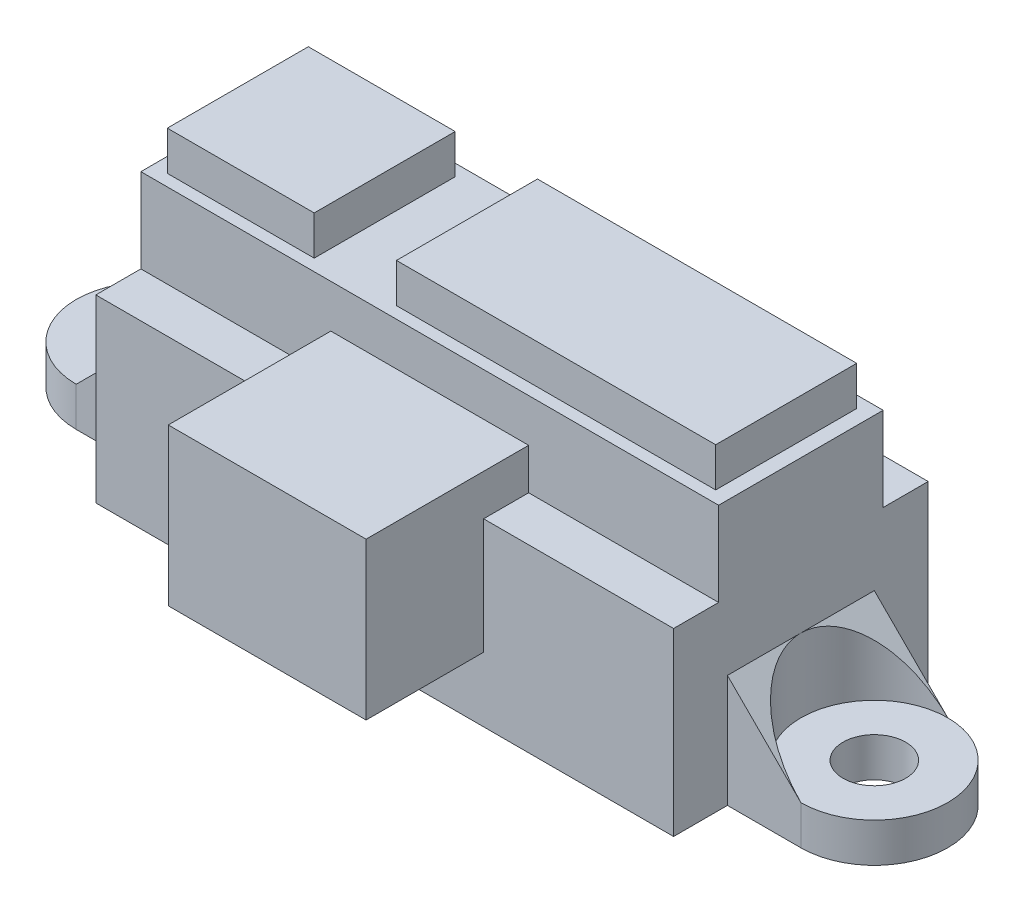
ISO-10303-21;
HEADER;
FILE_DESCRIPTION(('STEP AP214'),'2;1');
FILE_NAME('part.step','',(''),(''),'','','');
FILE_SCHEMA(('AUTOMOTIVE_DESIGN { 1 0 10303 214 1 1 1 1 }'));
ENDSEC;
DATA;
#1=APPLICATION_CONTEXT('core data for automotive mechanical design processes');
#2=APPLICATION_PROTOCOL_DEFINITION('international standard','automotive_design',2000,#1);
#3=PRODUCT_CONTEXT('',#1,'mechanical');
#4=PRODUCT('Part','Part','',(#3));
#5=PRODUCT_RELATED_PRODUCT_CATEGORY('part','',(#4));
#6=PRODUCT_DEFINITION_FORMATION('','',#4);
#7=PRODUCT_DEFINITION_CONTEXT('part definition',#1,'design');
#8=PRODUCT_DEFINITION('design','',#6,#7);
#9=PRODUCT_DEFINITION_SHAPE('','',#8);
#10=(LENGTH_UNIT() NAMED_UNIT(*) SI_UNIT(.MILLI.,.METRE.));
#11=(NAMED_UNIT(*) PLANE_ANGLE_UNIT() SI_UNIT($,.RADIAN.));
#12=(NAMED_UNIT(*) SI_UNIT($,.STERADIAN.) SOLID_ANGLE_UNIT());
#13=UNCERTAINTY_MEASURE_WITH_UNIT(LENGTH_MEASURE(1.E-05),#10,'distance_accuracy_value','');
#14=(GEOMETRIC_REPRESENTATION_CONTEXT(3) GLOBAL_UNCERTAINTY_ASSIGNED_CONTEXT((#13)) GLOBAL_UNIT_ASSIGNED_CONTEXT((#10,
#11,#12)) REPRESENTATION_CONTEXT('',''));
#15=CARTESIAN_POINT('',(0.,0.,0.));
#16=DIRECTION('',(0.,0.,1.));
#17=DIRECTION('',(1.,0.,0.));
#18=AXIS2_PLACEMENT_3D('',#15,#16,#17);
#19=CARTESIAN_POINT('',(14.75,9.2,6.5));
#20=DIRECTION('',(0.,1.,0.));
#21=DIRECTION('',(0.,0.,1.));
#22=AXIS2_PLACEMENT_3D('',#19,#20,#21);
#23=PLANE('',#22);
#24=DIRECTION('',(1.,0.,0.));
#25=VECTOR('',#24,1.);
#26=CARTESIAN_POINT('',(-14.75,9.2,4.2));
#27=LINE('',#26,#25);
#28=CARTESIAN_POINT('',(5.04999999999998,9.2,4.2));
#29=VERTEX_POINT('',#28);
#30=CARTESIAN_POINT('',(14.75,9.2,4.2));
#31=VERTEX_POINT('',#30);
#32=EDGE_CURVE('E351',#29,#31,#27,.T.);
#33=ORIENTED_EDGE('',*,*,#32,.F.);
#34=DIRECTION('',(0.,0.,1.));
#35=VECTOR('',#34,1.);
#36=CARTESIAN_POINT('',(5.04999999999998,9.2,6.5));
#37=LINE('',#36,#35);
#38=CARTESIAN_POINT('',(5.04999999999998,9.2,6.5));
#39=VERTEX_POINT('',#38);
#40=EDGE_CURVE('E269',#29,#39,#37,.T.);
#41=ORIENTED_EDGE('',*,*,#40,.T.);
#42=DIRECTION('',(-1.,0.,0.));
#43=VECTOR('',#42,1.);
#44=CARTESIAN_POINT('',(-14.75,9.2,6.5));
#45=LINE('',#44,#43);
#46=CARTESIAN_POINT('',(14.75,9.2,6.5));
#47=VERTEX_POINT('',#46);
#48=EDGE_CURVE('E368',#47,#39,#45,.T.);
#49=ORIENTED_EDGE('',*,*,#48,.F.);
#50=DIRECTION('',(0.,0.,1.));
#51=VECTOR('',#50,1.);
#52=CARTESIAN_POINT('',(14.75,9.2,-6.5));
#53=LINE('',#52,#51);
#54=EDGE_CURVE('E367',#31,#47,#53,.T.);
#55=ORIENTED_EDGE('',*,*,#54,.F.);
#56=EDGE_LOOP('',(#33,#41,#49,#55));
#57=FACE_BOUND('',#56,.T.);
#58=ADVANCED_FACE('F35',(#57),#23,.T.);
#59=CARTESIAN_POINT('',(-5.05000000000002,9.2,6.5));
#60=VERTEX_POINT('',#59);
#61=CARTESIAN_POINT('',(-14.75,9.2,6.5));
#62=VERTEX_POINT('',#61);
#63=EDGE_CURVE('E366',#60,#62,#45,.T.);
#64=ORIENTED_EDGE('',*,*,#63,.F.);
#65=DIRECTION('',(0.,0.,-1.));
#66=VECTOR('',#65,1.);
#67=CARTESIAN_POINT('',(-5.05000000000002,9.2,6.5));
#68=LINE('',#67,#66);
#69=CARTESIAN_POINT('',(-5.05000000000002,9.2,4.2));
#70=VERTEX_POINT('',#69);
#71=EDGE_CURVE('E259',#60,#70,#68,.T.);
#72=ORIENTED_EDGE('',*,*,#71,.T.);
#73=CARTESIAN_POINT('',(-14.75,9.2,4.2));
#74=VERTEX_POINT('',#73);
#75=EDGE_CURVE('E343',#74,#70,#27,.T.);
#76=ORIENTED_EDGE('',*,*,#75,.F.);
#77=DIRECTION('',(0.,0.,-1.));
#78=VECTOR('',#77,1.);
#79=CARTESIAN_POINT('',(-14.75,9.2,-6.5));
#80=LINE('',#79,#78);
#81=EDGE_CURVE('E371',#62,#74,#80,.T.);
#82=ORIENTED_EDGE('',*,*,#81,.F.);
#83=EDGE_LOOP('',(#64,#72,#76,#82));
#84=FACE_BOUND('',#83,.T.);
#85=ADVANCED_FACE('F526',(#84),#23,.T.);
#86=CARTESIAN_POINT('',(-14.75,9.2,6.5));
#87=DIRECTION('',(0.,0.,1.));
#88=DIRECTION('',(1.,0.,0.));
#89=AXIS2_PLACEMENT_3D('',#86,#87,#88);
#90=PLANE('',#89);
#91=ORIENTED_EDGE('',*,*,#48,.T.);
#92=DIRECTION('',(0.,-1.,0.));
#93=VECTOR('',#92,1.);
#94=CARTESIAN_POINT('',(5.04999999999998,9.2,6.5));
#95=LINE('',#94,#93);
#96=CARTESIAN_POINT('',(5.04999999999998,3.3,6.5));
#97=VERTEX_POINT('',#96);
#98=EDGE_CURVE('E53',#39,#97,#95,.T.);
#99=ORIENTED_EDGE('',*,*,#98,.T.);
#100=DIRECTION('',(-1.,0.,0.));
#101=VECTOR('',#100,1.);
#102=CARTESIAN_POINT('',(-14.75,3.3,6.5));
#103=LINE('',#102,#101);
#104=CARTESIAN_POINT('',(-5.05000000000002,3.3,6.5));
#105=VERTEX_POINT('',#104);
#106=EDGE_CURVE('E11',#97,#105,#103,.T.);
#107=ORIENTED_EDGE('',*,*,#106,.T.);
#108=DIRECTION('',(0.,1.,0.));
#109=VECTOR('',#108,1.);
#110=CARTESIAN_POINT('',(-5.05000000000002,9.2,6.5));
#111=LINE('',#110,#109);
#112=EDGE_CURVE('E262',#105,#60,#111,.T.);
#113=ORIENTED_EDGE('',*,*,#112,.T.);
#114=ORIENTED_EDGE('',*,*,#63,.T.);
#115=DIRECTION('',(0.,-1.,0.));
#116=VECTOR('',#115,1.);
#117=CARTESIAN_POINT('',(-14.75,9.2,6.5));
#118=LINE('',#117,#116);
#119=CARTESIAN_POINT('',(-14.75,0.,6.5));
#120=VERTEX_POINT('',#119);
#121=EDGE_CURVE('E397',#62,#120,#118,.T.);
#122=ORIENTED_EDGE('',*,*,#121,.T.);
#123=DIRECTION('',(-1.,0.,0.));
#124=VECTOR('',#123,1.);
#125=CARTESIAN_POINT('',(-14.75,0.,6.5));
#126=LINE('',#125,#124);
#127=CARTESIAN_POINT('',(14.75,0.,6.5));
#128=VERTEX_POINT('',#127);
#129=EDGE_CURVE('E381',#128,#120,#126,.T.);
#130=ORIENTED_EDGE('',*,*,#129,.F.);
#131=DIRECTION('',(0.,-1.,0.));
#132=VECTOR('',#131,1.);
#133=CARTESIAN_POINT('',(14.75,9.2,6.5));
#134=LINE('',#133,#132);
#135=EDGE_CURVE('E377',#47,#128,#134,.T.);
#136=ORIENTED_EDGE('',*,*,#135,.F.);
#137=EDGE_LOOP('',(#91,#99,#107,#113,#114,#122,#130,#136));
#138=FACE_BOUND('',#137,.T.);
#139=ADVANCED_FACE('F499',(#138),#90,.T.);
#140=CARTESIAN_POINT('',(-14.75,13.5,4.2));
#141=DIRECTION('',(0.,0.,-1.));
#142=DIRECTION('',(-1.,0.,0.));
#143=AXIS2_PLACEMENT_3D('',#140,#141,#142);
#144=PLANE('',#143);
#145=DIRECTION('',(0.,1.,0.));
#146=VECTOR('',#145,1.);
#147=CARTESIAN_POINT('',(5.04999999999998,13.5,4.2));
#148=LINE('',#147,#146);
#149=CARTESIAN_POINT('',(5.04999999999998,11.3,4.2));
#150=VERTEX_POINT('',#149);
#151=EDGE_CURVE('E43',#29,#150,#148,.T.);
#152=ORIENTED_EDGE('',*,*,#151,.F.);
#153=ORIENTED_EDGE('',*,*,#32,.T.);
#154=DIRECTION('',(0.,-1.,0.));
#155=VECTOR('',#154,1.);
#156=CARTESIAN_POINT('',(14.75,13.5,4.2));
#157=LINE('',#156,#155);
#158=CARTESIAN_POINT('',(14.75,13.5,4.2));
#159=VERTEX_POINT('',#158);
#160=EDGE_CURVE('E349',#159,#31,#157,.T.);
#161=ORIENTED_EDGE('',*,*,#160,.F.);
#162=DIRECTION('',(1.,0.,0.));
#163=VECTOR('',#162,1.);
#164=CARTESIAN_POINT('',(-14.75,13.5,4.2));
#165=LINE('',#164,#163);
#166=CARTESIAN_POINT('',(-14.75,13.5,4.2));
#167=VERTEX_POINT('',#166);
#168=EDGE_CURVE('E347',#167,#159,#165,.T.);
#169=ORIENTED_EDGE('',*,*,#168,.F.);
#170=DIRECTION('',(0.,-1.,0.));
#171=VECTOR('',#170,1.);
#172=CARTESIAN_POINT('',(-14.75,13.5,4.2));
#173=LINE('',#172,#171);
#174=EDGE_CURVE('E355',#167,#74,#173,.T.);
#175=ORIENTED_EDGE('',*,*,#174,.T.);
#176=ORIENTED_EDGE('',*,*,#75,.T.);
#177=DIRECTION('',(0.,-1.,0.));
#178=VECTOR('',#177,1.);
#179=CARTESIAN_POINT('',(-5.05000000000002,13.5,4.2));
#180=LINE('',#179,#178);
#181=CARTESIAN_POINT('',(-5.05000000000002,11.3,4.2));
#182=VERTEX_POINT('',#181);
#183=EDGE_CURVE('E478',#182,#70,#180,.T.);
#184=ORIENTED_EDGE('',*,*,#183,.F.);
#185=DIRECTION('',(-1.,0.,0.));
#186=VECTOR('',#185,1.);
#187=CARTESIAN_POINT('',(-14.75,11.3,4.2));
#188=LINE('',#187,#186);
#189=EDGE_CURVE('E481',#150,#182,#188,.T.);
#190=ORIENTED_EDGE('',*,*,#189,.F.);
#191=EDGE_LOOP('',(#152,#153,#161,#169,#175,#176,#184,#190));
#192=FACE_BOUND('',#191,.T.);
#193=ADVANCED_FACE('F510',(#192),#144,.F.);
#194=CARTESIAN_POINT('',(14.75,13.5,-4.2));
#195=DIRECTION('',(0.,-1.,0.));
#196=DIRECTION('',(0.,0.,-1.));
#197=AXIS2_PLACEMENT_3D('',#194,#195,#196);
#198=PLANE('',#197);
#199=DIRECTION('',(0.,0.,-1.));
#200=VECTOR('',#199,1.);
#201=CARTESIAN_POINT('',(-6.5,13.5,3.6));
#202=LINE('',#201,#200);
#203=CARTESIAN_POINT('',(-6.5,13.5,3.6));
#204=VERTEX_POINT('',#203);
#205=CARTESIAN_POINT('',(-6.5,13.5,-3.6));
#206=VERTEX_POINT('',#205);
#207=EDGE_CURVE('E305',#204,#206,#202,.T.);
#208=ORIENTED_EDGE('',*,*,#207,.F.);
#209=DIRECTION('',(1.,0.,0.));
#210=VECTOR('',#209,1.);
#211=CARTESIAN_POINT('',(-14.,13.5,3.6));
#212=LINE('',#211,#210);
#213=CARTESIAN_POINT('',(-14.,13.5,3.6));
#214=VERTEX_POINT('',#213);
#215=EDGE_CURVE('E310',#214,#204,#212,.T.);
#216=ORIENTED_EDGE('',*,*,#215,.F.);
#217=DIRECTION('',(0.,0.,1.));
#218=VECTOR('',#217,1.);
#219=CARTESIAN_POINT('',(-14.,13.5,3.6));
#220=LINE('',#219,#218);
#221=CARTESIAN_POINT('',(-14.,13.5,-3.6));
#222=VERTEX_POINT('',#221);
#223=EDGE_CURVE('E322',#222,#214,#220,.T.);
#224=ORIENTED_EDGE('',*,*,#223,.F.);
#225=DIRECTION('',(-1.,0.,0.));
#226=VECTOR('',#225,1.);
#227=CARTESIAN_POINT('',(-14.,13.5,-3.6));
#228=LINE('',#227,#226);
#229=EDGE_CURVE('E319',#206,#222,#228,.T.);
#230=ORIENTED_EDGE('',*,*,#229,.F.);
#231=EDGE_LOOP('',(#208,#216,#224,#230));
#232=FACE_BOUND('',#231,.T.);
#233=DIRECTION('',(0.,0.,-1.));
#234=VECTOR('',#233,1.);
#235=CARTESIAN_POINT('',(14.75,13.5,4.2));
#236=LINE('',#235,#234);
#237=CARTESIAN_POINT('',(14.75,13.5,-4.2));
#238=VERTEX_POINT('',#237);
#239=EDGE_CURVE('E339',#159,#238,#236,.T.);
#240=ORIENTED_EDGE('',*,*,#239,.T.);
#241=DIRECTION('',(-1.,0.,0.));
#242=VECTOR('',#241,1.);
#243=CARTESIAN_POINT('',(-14.75,13.5,-4.2));
#244=LINE('',#243,#242);
#245=CARTESIAN_POINT('',(-14.75,13.5,-4.2));
#246=VERTEX_POINT('',#245);
#247=EDGE_CURVE('E342',#238,#246,#244,.T.);
#248=ORIENTED_EDGE('',*,*,#247,.T.);
#249=DIRECTION('',(0.,0.,1.));
#250=VECTOR('',#249,1.);
#251=CARTESIAN_POINT('',(-14.75,13.5,4.2));
#252=LINE('',#251,#250);
#253=EDGE_CURVE('E345',#246,#167,#252,.T.);
#254=ORIENTED_EDGE('',*,*,#253,.T.);
#255=ORIENTED_EDGE('',*,*,#168,.T.);
#256=EDGE_LOOP('',(#240,#248,#254,#255));
#257=FACE_BOUND('',#256,.T.);
#258=DIRECTION('',(0.,0.,1.));
#259=VECTOR('',#258,1.);
#260=CARTESIAN_POINT('',(-2.29999999999999,13.5,3.6));
#261=LINE('',#260,#259);
#262=CARTESIAN_POINT('',(-2.29999999999999,13.5,-3.6));
#263=VERTEX_POINT('',#262);
#264=CARTESIAN_POINT('',(-2.29999999999999,13.5,3.6));
#265=VERTEX_POINT('',#264);
#266=EDGE_CURVE('E272',#263,#265,#261,.T.);
#267=ORIENTED_EDGE('',*,*,#266,.F.);
#268=DIRECTION('',(-1.,0.,0.));
#269=VECTOR('',#268,1.);
#270=CARTESIAN_POINT('',(14.,13.5,-3.6));
#271=LINE('',#270,#269);
#272=CARTESIAN_POINT('',(14.,13.5,-3.6));
#273=VERTEX_POINT('',#272);
#274=EDGE_CURVE('E277',#273,#263,#271,.T.);
#275=ORIENTED_EDGE('',*,*,#274,.F.);
#276=DIRECTION('',(0.,0.,-1.));
#277=VECTOR('',#276,1.);
#278=CARTESIAN_POINT('',(14.,13.5,3.6));
#279=LINE('',#278,#277);
#280=CARTESIAN_POINT('',(14.,13.5,3.6));
#281=VERTEX_POINT('',#280);
#282=EDGE_CURVE('E289',#281,#273,#279,.T.);
#283=ORIENTED_EDGE('',*,*,#282,.F.);
#284=DIRECTION('',(1.,0.,0.));
#285=VECTOR('',#284,1.);
#286=CARTESIAN_POINT('',(14.,13.5,3.6));
#287=LINE('',#286,#285);
#288=EDGE_CURVE('E286',#265,#281,#287,.T.);
#289=ORIENTED_EDGE('',*,*,#288,.F.);
#290=EDGE_LOOP('',(#267,#275,#283,#289));
#291=FACE_BOUND('',#290,.T.);
#292=ADVANCED_FACE('F514',(#232,#257,#291),#198,.F.);
#293=CARTESIAN_POINT('',(-14.75,9.2,-4.2));
#294=VERTEX_POINT('',#293);
#295=CARTESIAN_POINT('',(-14.75,9.2,-6.5));
#296=VERTEX_POINT('',#295);
#297=EDGE_CURVE('E370',#294,#296,#80,.T.);
#298=ORIENTED_EDGE('',*,*,#297,.F.);
#299=DIRECTION('',(-1.,0.,0.));
#300=VECTOR('',#299,1.);
#301=CARTESIAN_POINT('',(-14.75,9.2,-4.2));
#302=LINE('',#301,#300);
#303=CARTESIAN_POINT('',(14.75,9.2,-4.2));
#304=VERTEX_POINT('',#303);
#305=EDGE_CURVE('E338',#304,#294,#302,.T.);
#306=ORIENTED_EDGE('',*,*,#305,.F.);
#307=CARTESIAN_POINT('',(14.75,9.2,-6.5));
#308=VERTEX_POINT('',#307);
#309=EDGE_CURVE('E363',#308,#304,#53,.T.);
#310=ORIENTED_EDGE('',*,*,#309,.F.);
#311=DIRECTION('',(1.,0.,0.));
#312=VECTOR('',#311,1.);
#313=CARTESIAN_POINT('',(-14.75,9.2,-6.5));
#314=LINE('',#313,#312);
#315=EDGE_CURVE('E374',#296,#308,#314,.T.);
#316=ORIENTED_EDGE('',*,*,#315,.F.);
#317=EDGE_LOOP('',(#298,#306,#310,#316));
#318=FACE_BOUND('',#317,.T.);
#319=ADVANCED_FACE('F568',(#318),#23,.T.);
#320=CARTESIAN_POINT('',(10.5,10.,-6.25));
#321=DIRECTION('',(-0.707106781186549,-0.707106781186546,0.));
#322=DIRECTION('',(0.707106781186546,-0.707106781186549,0.));
#323=AXIS2_PLACEMENT_3D('',#320,#321,#322);
#324=PLANE('',#323);
#325=DIRECTION('',(0.707106781186546,-0.707106781186549,0.));
#326=VECTOR('',#325,1.);
#327=CARTESIAN_POINT('',(-3.99999999999991,24.5,-3.74999999999998));
#328=LINE('',#327,#326);
#329=CARTESIAN_POINT('',(14.75,5.75000000000003,-3.74999999999998));
#330=VERTEX_POINT('',#329);
#331=CARTESIAN_POINT('',(18.5,2.,-3.74999999999998));
#332=VERTEX_POINT('',#331);
#333=EDGE_CURVE('E431',#330,#332,#328,.T.);
#334=ORIENTED_EDGE('',*,*,#333,.F.);
#335=DIRECTION('',(0.,0.,1.));
#336=VECTOR('',#335,1.);
#337=CARTESIAN_POINT('',(14.75,5.75000000000003,-6.25));
#338=LINE('',#337,#336);
#339=CARTESIAN_POINT('',(14.75,5.75000000000001,0.));
#340=VERTEX_POINT('',#339);
#341=EDGE_CURVE('E403',#330,#340,#338,.T.);
#342=ORIENTED_EDGE('',*,*,#341,.T.);
#343=CARTESIAN_POINT('',(18.5,2.,0.));
#344=DIRECTION('',(-0.707106781186549,-0.707106781186546,0.));
#345=DIRECTION('',(0.707106781186546,-0.707106781186549,0.));
#346=AXIS2_PLACEMENT_3D('',#343,#344,#345);
#347=ELLIPSE('',#346,5.3033008588991,3.74999999999998);
#348=EDGE_CURVE('E475',#332,#340,#347,.F.);
#349=ORIENTED_EDGE('',*,*,#348,.F.);
#350=EDGE_LOOP('',(#334,#342,#349));
#351=FACE_BOUND('',#350,.T.);
#352=ADVANCED_FACE('F552',(#351),#324,.F.);
#353=CARTESIAN_POINT('',(18.5,2.,3.74999999999998));
#354=VERTEX_POINT('',#353);
#355=EDGE_CURVE('E474',#340,#354,#347,.F.);
#356=ORIENTED_EDGE('',*,*,#355,.F.);
#357=CARTESIAN_POINT('',(14.75,5.75000000000003,3.75));
#358=VERTEX_POINT('',#357);
#359=EDGE_CURVE('E393',#340,#358,#338,.T.);
#360=ORIENTED_EDGE('',*,*,#359,.T.);
#361=DIRECTION('',(0.707106781186546,-0.707106781186549,0.));
#362=VECTOR('',#361,1.);
#363=CARTESIAN_POINT('',(10.5,10.,3.75));
#364=LINE('',#363,#362);
#365=EDGE_CURVE('E422',#358,#354,#364,.T.);
#366=ORIENTED_EDGE('',*,*,#365,.T.);
#367=EDGE_LOOP('',(#356,#360,#366));
#368=FACE_BOUND('',#367,.T.);
#369=ADVANCED_FACE('F543',(#368),#324,.F.);
#370=CARTESIAN_POINT('',(-18.5,2.,-6.25));
#371=DIRECTION('',(0.707106781186549,-0.707106781186546,0.));
#372=DIRECTION('',(0.707106781186546,0.707106781186549,0.));
#373=AXIS2_PLACEMENT_3D('',#370,#371,#372);
#374=PLANE('',#373);
#375=DIRECTION('',(0.707106781186546,0.707106781186549,0.));
#376=VECTOR('',#375,1.);
#377=CARTESIAN_POINT('',(-18.5,2.,3.75));
#378=LINE('',#377,#376);
#379=CARTESIAN_POINT('',(-18.5,2.,3.75));
#380=VERTEX_POINT('',#379);
#381=CARTESIAN_POINT('',(-14.75,5.74999999999999,3.75));
#382=VERTEX_POINT('',#381);
#383=EDGE_CURVE('E419',#380,#382,#378,.T.);
#384=ORIENTED_EDGE('',*,*,#383,.T.);
#385=DIRECTION('',(0.,0.,-1.));
#386=VECTOR('',#385,1.);
#387=CARTESIAN_POINT('',(-14.75,5.74999999999999,-6.25));
#388=LINE('',#387,#386);
#389=CARTESIAN_POINT('',(-14.75,5.74999999999999,0.));
#390=VERTEX_POINT('',#389);
#391=EDGE_CURVE('E411',#382,#390,#388,.T.);
#392=ORIENTED_EDGE('',*,*,#391,.T.);
#393=CARTESIAN_POINT('',(-18.5,2.,0.));
#394=DIRECTION('',(0.707106781186549,-0.707106781186546,0.));
#395=DIRECTION('',(-0.707106781186546,-0.707106781186549,0.));
#396=AXIS2_PLACEMENT_3D('',#393,#394,#395);
#397=ELLIPSE('',#396,5.30330085889909,3.74999999999998);
#398=EDGE_CURVE('E471',#380,#390,#397,.F.);
#399=ORIENTED_EDGE('',*,*,#398,.F.);
#400=EDGE_LOOP('',(#384,#392,#399));
#401=FACE_BOUND('',#400,.T.);
#402=ADVANCED_FACE('F842',(#401),#374,.F.);
#403=CARTESIAN_POINT('',(-18.5,2.,-3.74999999999997));
#404=VERTEX_POINT('',#403);
#405=EDGE_CURVE('E470',#390,#404,#397,.F.);
#406=ORIENTED_EDGE('',*,*,#405,.F.);
#407=CARTESIAN_POINT('',(-14.75,5.74999999999999,-3.74999999999997));
#408=VERTEX_POINT('',#407);
#409=EDGE_CURVE('E408',#390,#408,#388,.T.);
#410=ORIENTED_EDGE('',*,*,#409,.T.);
#411=DIRECTION('',(0.707106781186546,0.707106781186549,0.));
#412=VECTOR('',#411,1.);
#413=CARTESIAN_POINT('',(-14.5,6.00000000000002,-3.74999999999997));
#414=LINE('',#413,#412);
#415=EDGE_CURVE('E428',#404,#408,#414,.T.);
#416=ORIENTED_EDGE('',*,*,#415,.F.);
#417=EDGE_LOOP('',(#406,#410,#416));
#418=FACE_BOUND('',#417,.T.);
#419=ADVANCED_FACE('F834',(#418),#374,.F.);
#420=CARTESIAN_POINT('',(-18.5,10.,-3.74999999999997));
#421=DIRECTION('',(0.,0.,1.));
#422=DIRECTION('',(1.,0.,0.));
#423=AXIS2_PLACEMENT_3D('',#420,#421,#422);
#424=PLANE('',#423);
#425=DIRECTION('',(-1.,0.,0.));
#426=VECTOR('',#425,1.);
#427=CARTESIAN_POINT('',(-18.5,0.,-3.74999999999997));
#428=LINE('',#427,#426);
#429=CARTESIAN_POINT('',(18.5,0.,-3.74999999999998));
#430=VERTEX_POINT('',#429);
#431=CARTESIAN_POINT('',(14.75,0.,-3.74999999999998));
#432=VERTEX_POINT('',#431);
#433=EDGE_CURVE('E446',#430,#432,#428,.T.);
#434=ORIENTED_EDGE('',*,*,#433,.T.);
#435=DIRECTION('',(0.,1.,0.));
#436=VECTOR('',#435,1.);
#437=CARTESIAN_POINT('',(14.75,10.,-3.74999999999998));
#438=LINE('',#437,#436);
#439=EDGE_CURVE('E406',#432,#330,#438,.T.);
#440=ORIENTED_EDGE('',*,*,#439,.T.);
#441=ORIENTED_EDGE('',*,*,#333,.T.);
#442=DIRECTION('',(0.,-1.,0.));
#443=VECTOR('',#442,1.);
#444=CARTESIAN_POINT('',(18.5,10.,-3.74999999999998));
#445=LINE('',#444,#443);
#446=EDGE_CURVE('E462',#332,#430,#445,.T.);
#447=ORIENTED_EDGE('',*,*,#446,.T.);
#448=EDGE_LOOP('',(#434,#440,#441,#447));
#449=FACE_BOUND('',#448,.T.);
#450=ADVANCED_FACE('F559',(#449),#424,.F.);
#451=ORIENTED_EDGE('',*,*,#415,.T.);
#452=DIRECTION('',(0.,-1.,0.));
#453=VECTOR('',#452,1.);
#454=CARTESIAN_POINT('',(-14.75,10.,-3.74999999999997));
#455=LINE('',#454,#453);
#456=CARTESIAN_POINT('',(-14.75,0.,-3.74999999999997));
#457=VERTEX_POINT('',#456);
#458=EDGE_CURVE('E410',#408,#457,#455,.T.);
#459=ORIENTED_EDGE('',*,*,#458,.T.);
#460=CARTESIAN_POINT('',(-18.5,0.,-3.74999999999997));
#461=VERTEX_POINT('',#460);
#462=EDGE_CURVE('E445',#457,#461,#428,.T.);
#463=ORIENTED_EDGE('',*,*,#462,.T.);
#464=DIRECTION('',(0.,-1.,0.));
#465=VECTOR('',#464,1.);
#466=CARTESIAN_POINT('',(-18.5,10.,-3.74999999999997));
#467=LINE('',#466,#465);
#468=EDGE_CURVE('E459',#404,#461,#467,.T.);
#469=ORIENTED_EDGE('',*,*,#468,.F.);
#470=EDGE_LOOP('',(#451,#459,#463,#469));
#471=FACE_BOUND('',#470,.T.);
#472=ADVANCED_FACE('F818',(#471),#424,.F.);
#473=CARTESIAN_POINT('',(-18.5,10.,3.75));
#474=DIRECTION('',(0.,0.,-1.));
#475=DIRECTION('',(-1.,0.,0.));
#476=AXIS2_PLACEMENT_3D('',#473,#474,#475);
#477=PLANE('',#476);
#478=ORIENTED_EDGE('',*,*,#365,.F.);
#479=DIRECTION('',(0.,-1.,0.));
#480=VECTOR('',#479,1.);
#481=CARTESIAN_POINT('',(14.75,10.,3.75));
#482=LINE('',#481,#480);
#483=CARTESIAN_POINT('',(14.75,0.,3.75));
#484=VERTEX_POINT('',#483);
#485=EDGE_CURVE('E402',#358,#484,#482,.T.);
#486=ORIENTED_EDGE('',*,*,#485,.T.);
#487=DIRECTION('',(1.,0.,0.));
#488=VECTOR('',#487,1.);
#489=CARTESIAN_POINT('',(-18.5,0.,3.75));
#490=LINE('',#489,#488);
#491=CARTESIAN_POINT('',(18.5,0.,3.75));
#492=VERTEX_POINT('',#491);
#493=EDGE_CURVE('E451',#484,#492,#490,.T.);
#494=ORIENTED_EDGE('',*,*,#493,.T.);
#495=DIRECTION('',(0.,-1.,0.));
#496=VECTOR('',#495,1.);
#497=CARTESIAN_POINT('',(18.5,10.,3.75));
#498=LINE('',#497,#496);
#499=EDGE_CURVE('E454',#354,#492,#498,.T.);
#500=ORIENTED_EDGE('',*,*,#499,.F.);
#501=EDGE_LOOP('',(#478,#486,#494,#500));
#502=FACE_BOUND('',#501,.T.);
#503=ADVANCED_FACE('F538',(#502),#477,.F.);
#504=CARTESIAN_POINT('',(-18.5,0.,3.75));
#505=VERTEX_POINT('',#504);
#506=CARTESIAN_POINT('',(-14.75,0.,3.75));
#507=VERTEX_POINT('',#506);
#508=EDGE_CURVE('E452',#505,#507,#490,.T.);
#509=ORIENTED_EDGE('',*,*,#508,.T.);
#510=DIRECTION('',(0.,1.,0.));
#511=VECTOR('',#510,1.);
#512=CARTESIAN_POINT('',(-14.75,10.,3.75));
#513=LINE('',#512,#511);
#514=EDGE_CURVE('E413',#507,#382,#513,.T.);
#515=ORIENTED_EDGE('',*,*,#514,.T.);
#516=ORIENTED_EDGE('',*,*,#383,.F.);
#517=DIRECTION('',(0.,-1.,0.));
#518=VECTOR('',#517,1.);
#519=CARTESIAN_POINT('',(-18.5,10.,3.75));
#520=LINE('',#519,#518);
#521=EDGE_CURVE('E457',#380,#505,#520,.T.);
#522=ORIENTED_EDGE('',*,*,#521,.T.);
#523=EDGE_LOOP('',(#509,#515,#516,#522));
#524=FACE_BOUND('',#523,.T.);
#525=ADVANCED_FACE('F803',(#524),#477,.F.);
#526=CARTESIAN_POINT('',(18.5,10.,0.));
#527=DIRECTION('',(0.,-1.,0.));
#528=DIRECTION('',(0.,0.,-1.));
#529=AXIS2_PLACEMENT_3D('',#526,#527,#528);
#530=CYLINDRICAL_SURFACE('',#529,1.60000000000001);
#531=CARTESIAN_POINT('',(18.5,0.,0.));
#532=DIRECTION('',(0.,1.,0.));
#533=DIRECTION('',(0.,0.,1.));
#534=AXIS2_PLACEMENT_3D('',#531,#532,#533);
#535=CIRCLE('',#534,1.60000000000001);
#536=CARTESIAN_POINT('',(18.5,0.,1.60000000000001));
#537=VERTEX_POINT('',#536);
#538=EDGE_CURVE('E439',#537,#537,#535,.T.);
#539=ORIENTED_EDGE('',*,*,#538,.F.);
#540=EDGE_LOOP('',(#539));
#541=FACE_BOUND('',#540,.T.);
#542=CARTESIAN_POINT('',(18.5,2.,0.));
#543=DIRECTION('',(0.,-1.,0.));
#544=DIRECTION('',(0.,0.,-1.));
#545=AXIS2_PLACEMENT_3D('',#542,#543,#544);
#546=CIRCLE('',#545,1.60000000000001);
#547=CARTESIAN_POINT('',(18.5,2.,-1.60000000000001));
#548=VERTEX_POINT('',#547);
#549=EDGE_CURVE('E467',#548,#548,#546,.T.);
#550=ORIENTED_EDGE('',*,*,#549,.F.);
#551=EDGE_LOOP('',(#550));
#552=FACE_BOUND('',#551,.T.);
#553=ADVANCED_FACE('F807',(#541,#552),#530,.F.);
#554=CARTESIAN_POINT('',(-18.5,10.,0.));
#555=DIRECTION('',(0.,-1.,0.));
#556=DIRECTION('',(0.,0.,-1.));
#557=AXIS2_PLACEMENT_3D('',#554,#555,#556);
#558=CYLINDRICAL_SURFACE('',#557,1.6);
#559=CARTESIAN_POINT('',(-18.5,0.,0.));
#560=DIRECTION('',(0.,1.,0.));
#561=DIRECTION('',(0.,0.,1.));
#562=AXIS2_PLACEMENT_3D('',#559,#560,#561);
#563=CIRCLE('',#562,1.6);
#564=CARTESIAN_POINT('',(-18.5,0.,1.60000000000001));
#565=VERTEX_POINT('',#564);
#566=EDGE_CURVE('E436',#565,#565,#563,.T.);
#567=ORIENTED_EDGE('',*,*,#566,.F.);
#568=EDGE_LOOP('',(#567));
#569=FACE_BOUND('',#568,.T.);
#570=CARTESIAN_POINT('',(-18.5,2.,0.));
#571=DIRECTION('',(0.,-1.,0.));
#572=DIRECTION('',(0.,0.,-1.));
#573=AXIS2_PLACEMENT_3D('',#570,#571,#572);
#574=CIRCLE('',#573,1.6);
#575=CARTESIAN_POINT('',(-18.5,2.,-1.59999999999998));
#576=VERTEX_POINT('',#575);
#577=EDGE_CURVE('E464',#576,#576,#574,.T.);
#578=ORIENTED_EDGE('',*,*,#577,.F.);
#579=EDGE_LOOP('',(#578));
#580=FACE_BOUND('',#579,.T.);
#581=ADVANCED_FACE('F794',(#569,#580),#558,.F.);
#582=CARTESIAN_POINT('',(18.5,0.,0.));
#583=DIRECTION('',(0.,1.,0.));
#584=DIRECTION('',(0.,0.,1.));
#585=AXIS2_PLACEMENT_3D('',#582,#583,#584);
#586=PLANE('',#585);
#587=ORIENTED_EDGE('',*,*,#462,.F.);
#588=DIRECTION('',(0.,0.,-1.));
#589=VECTOR('',#588,1.);
#590=CARTESIAN_POINT('',(-14.75,0.,-6.5));
#591=LINE('',#590,#589);
#592=CARTESIAN_POINT('',(-14.75,0.,-6.5));
#593=VERTEX_POINT('',#592);
#594=EDGE_CURVE('E384',#457,#593,#591,.T.);
#595=ORIENTED_EDGE('',*,*,#594,.T.);
#596=DIRECTION('',(1.,0.,0.));
#597=VECTOR('',#596,1.);
#598=CARTESIAN_POINT('',(-14.75,0.,-6.5));
#599=LINE('',#598,#597);
#600=CARTESIAN_POINT('',(14.75,0.,-6.5));
#601=VERTEX_POINT('',#600);
#602=EDGE_CURVE('E388',#593,#601,#599,.T.);
#603=ORIENTED_EDGE('',*,*,#602,.T.);
#604=DIRECTION('',(0.,0.,1.));
#605=VECTOR('',#604,1.);
#606=CARTESIAN_POINT('',(14.75,0.,-6.5));
#607=LINE('',#606,#605);
#608=EDGE_CURVE('E378',#601,#432,#607,.T.);
#609=ORIENTED_EDGE('',*,*,#608,.T.);
#610=ORIENTED_EDGE('',*,*,#433,.F.);
#611=CARTESIAN_POINT('',(18.5,0.,0.));
#612=DIRECTION('',(0.,1.,0.));
#613=DIRECTION('',(0.,0.,1.));
#614=AXIS2_PLACEMENT_3D('',#611,#612,#613);
#615=CIRCLE('',#614,3.74999999999999);
#616=EDGE_CURVE('E442',#492,#430,#615,.T.);
#617=ORIENTED_EDGE('',*,*,#616,.F.);
#618=ORIENTED_EDGE('',*,*,#493,.F.);
#619=EDGE_CURVE('E362',#484,#128,#607,.T.);
#620=ORIENTED_EDGE('',*,*,#619,.T.);
#621=ORIENTED_EDGE('',*,*,#129,.T.);
#622=EDGE_CURVE('E385',#120,#507,#591,.T.);
#623=ORIENTED_EDGE('',*,*,#622,.T.);
#624=ORIENTED_EDGE('',*,*,#508,.F.);
#625=CARTESIAN_POINT('',(-18.5,0.,0.));
#626=DIRECTION('',(0.,1.,0.));
#627=DIRECTION('',(0.,0.,1.));
#628=AXIS2_PLACEMENT_3D('',#625,#626,#627);
#629=CIRCLE('',#628,3.74999999999998);
#630=EDGE_CURVE('E448',#461,#505,#629,.T.);
#631=ORIENTED_EDGE('',*,*,#630,.F.);
#632=EDGE_LOOP('',(#587,#595,#603,#609,#610,#617,#618,#620,#621,#623,#624,#631));
#633=FACE_BOUND('',#632,.T.);
#634=ORIENTED_EDGE('',*,*,#566,.T.);
#635=EDGE_LOOP('',(#634));
#636=FACE_BOUND('',#635,.T.);
#637=ORIENTED_EDGE('',*,*,#538,.T.);
#638=EDGE_LOOP('',(#637));
#639=FACE_BOUND('',#638,.T.);
#640=ADVANCED_FACE('F531',(#633,#636,#639),#586,.F.);
#641=CARTESIAN_POINT('',(18.5,10.,0.));
#642=DIRECTION('',(0.,-1.,0.));
#643=DIRECTION('',(0.,0.,-1.));
#644=AXIS2_PLACEMENT_3D('',#641,#642,#643);
#645=CYLINDRICAL_SURFACE('',#644,3.74999999999999);
#646=ORIENTED_EDGE('',*,*,#446,.F.);
#647=CARTESIAN_POINT('',(18.5,2.,0.));
#648=DIRECTION('',(0.,-1.,0.));
#649=DIRECTION('',(0.,0.,-1.));
#650=AXIS2_PLACEMENT_3D('',#647,#648,#649);
#651=CIRCLE('',#650,3.74999999999999);
#652=EDGE_CURVE('E433',#332,#354,#651,.T.);
#653=ORIENTED_EDGE('',*,*,#652,.T.);
#654=ORIENTED_EDGE('',*,*,#499,.T.);
#655=ORIENTED_EDGE('',*,*,#616,.T.);
#656=EDGE_LOOP('',(#646,#653,#654,#655));
#657=FACE_BOUND('',#656,.T.);
#658=ADVANCED_FACE('F37',(#657),#645,.T.);
#659=CARTESIAN_POINT('',(-18.5,10.,0.));
#660=DIRECTION('',(0.,-1.,0.));
#661=DIRECTION('',(0.,0.,-1.));
#662=AXIS2_PLACEMENT_3D('',#659,#660,#661);
#663=CYLINDRICAL_SURFACE('',#662,3.74999999999998);
#664=ORIENTED_EDGE('',*,*,#521,.F.);
#665=CARTESIAN_POINT('',(-18.5,2.,0.));
#666=DIRECTION('',(0.,-1.,0.));
#667=DIRECTION('',(0.,0.,-1.));
#668=AXIS2_PLACEMENT_3D('',#665,#666,#667);
#669=CIRCLE('',#668,3.74999999999998);
#670=EDGE_CURVE('E425',#380,#404,#669,.T.);
#671=ORIENTED_EDGE('',*,*,#670,.T.);
#672=ORIENTED_EDGE('',*,*,#468,.T.);
#673=ORIENTED_EDGE('',*,*,#630,.T.);
#674=EDGE_LOOP('',(#664,#671,#672,#673));
#675=FACE_BOUND('',#674,.T.);
#676=ADVANCED_FACE('F781',(#675),#663,.T.);
#677=CARTESIAN_POINT('',(-22.25,2.,-6.25));
#678=DIRECTION('',(0.,-1.,0.));
#679=DIRECTION('',(0.,0.,-1.));
#680=AXIS2_PLACEMENT_3D('',#677,#678,#679);
#681=PLANE('',#680);
#682=ORIENTED_EDGE('',*,*,#577,.T.);
#683=EDGE_LOOP('',(#682));
#684=FACE_BOUND('',#683,.T.);
#685=ORIENTED_EDGE('',*,*,#670,.F.);
#686=CARTESIAN_POINT('',(-18.5,2.,0.));
#687=DIRECTION('',(0.,1.,0.));
#688=DIRECTION('',(0.,0.,1.));
#689=AXIS2_PLACEMENT_3D('',#686,#687,#688);
#690=CIRCLE('',#689,3.74999999999998);
#691=EDGE_CURVE('E417',#380,#404,#690,.T.);
#692=ORIENTED_EDGE('',*,*,#691,.T.);
#693=EDGE_LOOP('',(#685,#692));
#694=FACE_BOUND('',#693,.T.);
#695=ADVANCED_FACE('F771',(#684,#694),#681,.F.);
#696=CARTESIAN_POINT('',(18.5,2.,-6.25));
#697=DIRECTION('',(0.,-1.,0.));
#698=DIRECTION('',(0.,0.,-1.));
#699=AXIS2_PLACEMENT_3D('',#696,#697,#698);
#700=PLANE('',#699);
#701=CARTESIAN_POINT('',(18.5,2.,0.));
#702=DIRECTION('',(0.,1.,0.));
#703=DIRECTION('',(0.,0.,1.));
#704=AXIS2_PLACEMENT_3D('',#701,#702,#703);
#705=CIRCLE('',#704,3.74999999999998);
#706=EDGE_CURVE('E415',#332,#354,#705,.T.);
#707=ORIENTED_EDGE('',*,*,#706,.T.);
#708=ORIENTED_EDGE('',*,*,#652,.F.);
#709=EDGE_LOOP('',(#707,#708));
#710=FACE_BOUND('',#709,.T.);
#711=ORIENTED_EDGE('',*,*,#549,.T.);
#712=EDGE_LOOP('',(#711));
#713=FACE_BOUND('',#712,.T.);
#714=ADVANCED_FACE('F555',(#710,#713),#700,.F.);
#715=CARTESIAN_POINT('',(-18.5,12.,0.));
#716=DIRECTION('',(0.,-1.,0.));
#717=DIRECTION('',(0.,0.,-1.));
#718=AXIS2_PLACEMENT_3D('',#715,#716,#717);
#719=CYLINDRICAL_SURFACE('',#718,3.74999999999998);
#720=ORIENTED_EDGE('',*,*,#405,.T.);
#721=ORIENTED_EDGE('',*,*,#691,.F.);
#722=ORIENTED_EDGE('',*,*,#398,.T.);
#723=EDGE_LOOP('',(#720,#721,#722));
#724=FACE_BOUND('',#723,.T.);
#725=ADVANCED_FACE('F752',(#724),#719,.F.);
#726=CARTESIAN_POINT('',(18.5,12.,0.));
#727=DIRECTION('',(0.,-1.,0.));
#728=DIRECTION('',(0.,0.,-1.));
#729=AXIS2_PLACEMENT_3D('',#726,#727,#728);
#730=CYLINDRICAL_SURFACE('',#729,3.74999999999998);
#731=ORIENTED_EDGE('',*,*,#355,.T.);
#732=ORIENTED_EDGE('',*,*,#706,.F.);
#733=ORIENTED_EDGE('',*,*,#348,.T.);
#734=EDGE_LOOP('',(#731,#732,#733));
#735=FACE_BOUND('',#734,.T.);
#736=ADVANCED_FACE('F548',(#735),#730,.F.);
#737=CARTESIAN_POINT('',(-14.75,9.2,-6.5));
#738=DIRECTION('',(-1.,0.,0.));
#739=DIRECTION('',(0.,0.,1.));
#740=AXIS2_PLACEMENT_3D('',#737,#738,#739);
#741=PLANE('',#740);
#742=ORIENTED_EDGE('',*,*,#391,.F.);
#743=ORIENTED_EDGE('',*,*,#514,.F.);
#744=ORIENTED_EDGE('',*,*,#622,.F.);
#745=ORIENTED_EDGE('',*,*,#121,.F.);
#746=ORIENTED_EDGE('',*,*,#81,.T.);
#747=ORIENTED_EDGE('',*,*,#174,.F.);
#748=ORIENTED_EDGE('',*,*,#253,.F.);
#749=DIRECTION('',(0.,-1.,0.));
#750=VECTOR('',#749,1.);
#751=CARTESIAN_POINT('',(-14.75,13.5,-4.2));
#752=LINE('',#751,#750);
#753=EDGE_CURVE('E357',#246,#294,#752,.T.);
#754=ORIENTED_EDGE('',*,*,#753,.T.);
#755=ORIENTED_EDGE('',*,*,#297,.T.);
#756=DIRECTION('',(0.,-1.,0.));
#757=VECTOR('',#756,1.);
#758=CARTESIAN_POINT('',(-14.75,9.2,-6.5));
#759=LINE('',#758,#757);
#760=EDGE_CURVE('E394',#296,#593,#759,.T.);
#761=ORIENTED_EDGE('',*,*,#760,.T.);
#762=ORIENTED_EDGE('',*,*,#594,.F.);
#763=ORIENTED_EDGE('',*,*,#458,.F.);
#764=ORIENTED_EDGE('',*,*,#409,.F.);
#765=EDGE_LOOP('',(#742,#743,#744,#745,#746,#747,#748,#754,#755,#761,#762,#763,#764));
#766=FACE_BOUND('',#765,.T.);
#767=ADVANCED_FACE('F520',(#766),#741,.T.);
#768=CARTESIAN_POINT('',(14.75,9.2,-6.5));
#769=DIRECTION('',(1.,0.,0.));
#770=DIRECTION('',(0.,0.,-1.));
#771=AXIS2_PLACEMENT_3D('',#768,#769,#770);
#772=PLANE('',#771);
#773=ORIENTED_EDGE('',*,*,#341,.F.);
#774=ORIENTED_EDGE('',*,*,#439,.F.);
#775=ORIENTED_EDGE('',*,*,#608,.F.);
#776=DIRECTION('',(0.,-1.,0.));
#777=VECTOR('',#776,1.);
#778=CARTESIAN_POINT('',(14.75,9.2,-6.5));
#779=LINE('',#778,#777);
#780=EDGE_CURVE('E391',#308,#601,#779,.T.);
#781=ORIENTED_EDGE('',*,*,#780,.F.);
#782=ORIENTED_EDGE('',*,*,#309,.T.);
#783=DIRECTION('',(0.,-1.,0.));
#784=VECTOR('',#783,1.);
#785=CARTESIAN_POINT('',(14.75,13.5,-4.2));
#786=LINE('',#785,#784);
#787=EDGE_CURVE('E360',#238,#304,#786,.T.);
#788=ORIENTED_EDGE('',*,*,#787,.F.);
#789=ORIENTED_EDGE('',*,*,#239,.F.);
#790=ORIENTED_EDGE('',*,*,#160,.T.);
#791=ORIENTED_EDGE('',*,*,#54,.T.);
#792=ORIENTED_EDGE('',*,*,#135,.T.);
#793=ORIENTED_EDGE('',*,*,#619,.F.);
#794=ORIENTED_EDGE('',*,*,#485,.F.);
#795=ORIENTED_EDGE('',*,*,#359,.F.);
#796=EDGE_LOOP('',(#773,#774,#775,#781,#782,#788,#789,#790,#791,#792,#793,#794,#795));
#797=FACE_BOUND('',#796,.T.);
#798=ADVANCED_FACE('F504',(#797),#772,.T.);
#799=CARTESIAN_POINT('',(-14.75,9.2,-6.5));
#800=DIRECTION('',(0.,0.,-1.));
#801=DIRECTION('',(-1.,0.,0.));
#802=AXIS2_PLACEMENT_3D('',#799,#800,#801);
#803=PLANE('',#802);
#804=ORIENTED_EDGE('',*,*,#602,.F.);
#805=ORIENTED_EDGE('',*,*,#760,.F.);
#806=ORIENTED_EDGE('',*,*,#315,.T.);
#807=ORIENTED_EDGE('',*,*,#780,.T.);
#808=EDGE_LOOP('',(#804,#805,#806,#807));
#809=FACE_BOUND('',#808,.T.);
#810=ADVANCED_FACE('F570',(#809),#803,.T.);
#811=CARTESIAN_POINT('',(-14.75,13.5,-4.2));
#812=DIRECTION('',(0.,0.,1.));
#813=DIRECTION('',(1.,0.,0.));
#814=AXIS2_PLACEMENT_3D('',#811,#812,#813);
#815=PLANE('',#814);
#816=ORIENTED_EDGE('',*,*,#305,.T.);
#817=ORIENTED_EDGE('',*,*,#753,.F.);
#818=ORIENTED_EDGE('',*,*,#247,.F.);
#819=ORIENTED_EDGE('',*,*,#787,.T.);
#820=EDGE_LOOP('',(#816,#817,#818,#819));
#821=FACE_BOUND('',#820,.T.);
#822=ADVANCED_FACE('F574',(#821),#815,.F.);
#823=CARTESIAN_POINT('',(-6.5,15.5,3.6));
#824=DIRECTION('',(-1.,0.,0.));
#825=DIRECTION('',(0.,0.,1.));
#826=AXIS2_PLACEMENT_3D('',#823,#824,#825);
#827=PLANE('',#826);
#828=ORIENTED_EDGE('',*,*,#207,.T.);
#829=DIRECTION('',(0.,-1.,0.));
#830=VECTOR('',#829,1.);
#831=CARTESIAN_POINT('',(-6.5,15.5,-3.6));
#832=LINE('',#831,#830);
#833=CARTESIAN_POINT('',(-6.5,15.5,-3.6));
#834=VERTEX_POINT('',#833);
#835=EDGE_CURVE('E335',#834,#206,#832,.T.);
#836=ORIENTED_EDGE('',*,*,#835,.F.);
#837=DIRECTION('',(0.,0.,-1.));
#838=VECTOR('',#837,1.);
#839=CARTESIAN_POINT('',(-6.5,15.5,3.6));
#840=LINE('',#839,#838);
#841=CARTESIAN_POINT('',(-6.5,15.5,3.6));
#842=VERTEX_POINT('',#841);
#843=EDGE_CURVE('E306',#842,#834,#840,.T.);
#844=ORIENTED_EDGE('',*,*,#843,.F.);
#845=DIRECTION('',(0.,-1.,0.));
#846=VECTOR('',#845,1.);
#847=CARTESIAN_POINT('',(-6.5,15.5,3.6));
#848=LINE('',#847,#846);
#849=EDGE_CURVE('E316',#842,#204,#848,.T.);
#850=ORIENTED_EDGE('',*,*,#849,.T.);
#851=EDGE_LOOP('',(#828,#836,#844,#850));
#852=FACE_BOUND('',#851,.T.);
#853=ADVANCED_FACE('F576',(#852),#827,.F.);
#854=CARTESIAN_POINT('',(-14.,15.5,-3.6));
#855=DIRECTION('',(0.,0.,1.));
#856=DIRECTION('',(1.,0.,0.));
#857=AXIS2_PLACEMENT_3D('',#854,#855,#856);
#858=PLANE('',#857);
#859=ORIENTED_EDGE('',*,*,#229,.T.);
#860=DIRECTION('',(0.,-1.,0.));
#861=VECTOR('',#860,1.);
#862=CARTESIAN_POINT('',(-14.,15.5,-3.6));
#863=LINE('',#862,#861);
#864=CARTESIAN_POINT('',(-14.,15.5,-3.6));
#865=VERTEX_POINT('',#864);
#866=EDGE_CURVE('E332',#865,#222,#863,.T.);
#867=ORIENTED_EDGE('',*,*,#866,.F.);
#868=DIRECTION('',(-1.,0.,0.));
#869=VECTOR('',#868,1.);
#870=CARTESIAN_POINT('',(-14.,15.5,-3.6));
#871=LINE('',#870,#869);
#872=EDGE_CURVE('E309',#834,#865,#871,.T.);
#873=ORIENTED_EDGE('',*,*,#872,.F.);
#874=ORIENTED_EDGE('',*,*,#835,.T.);
#875=EDGE_LOOP('',(#859,#867,#873,#874));
#876=FACE_BOUND('',#875,.T.);
#877=ADVANCED_FACE('F582',(#876),#858,.F.);
#878=CARTESIAN_POINT('',(-14.,15.5,3.6));
#879=DIRECTION('',(1.,0.,0.));
#880=DIRECTION('',(0.,0.,-1.));
#881=AXIS2_PLACEMENT_3D('',#878,#879,#880);
#882=PLANE('',#881);
#883=ORIENTED_EDGE('',*,*,#223,.T.);
#884=DIRECTION('',(0.,-1.,0.));
#885=VECTOR('',#884,1.);
#886=CARTESIAN_POINT('',(-14.,15.5,3.6));
#887=LINE('',#886,#885);
#888=CARTESIAN_POINT('',(-14.,15.5,3.6));
#889=VERTEX_POINT('',#888);
#890=EDGE_CURVE('E329',#889,#214,#887,.T.);
#891=ORIENTED_EDGE('',*,*,#890,.F.);
#892=DIRECTION('',(0.,0.,1.));
#893=VECTOR('',#892,1.);
#894=CARTESIAN_POINT('',(-14.,15.5,3.6));
#895=LINE('',#894,#893);
#896=EDGE_CURVE('E312',#865,#889,#895,.T.);
#897=ORIENTED_EDGE('',*,*,#896,.F.);
#898=ORIENTED_EDGE('',*,*,#866,.T.);
#899=EDGE_LOOP('',(#883,#891,#897,#898));
#900=FACE_BOUND('',#899,.T.);
#901=ADVANCED_FACE('F606',(#900),#882,.F.);
#902=CARTESIAN_POINT('',(-14.,15.5,3.6));
#903=DIRECTION('',(0.,0.,-1.));
#904=DIRECTION('',(-1.,0.,0.));
#905=AXIS2_PLACEMENT_3D('',#902,#903,#904);
#906=PLANE('',#905);
#907=ORIENTED_EDGE('',*,*,#215,.T.);
#908=ORIENTED_EDGE('',*,*,#849,.F.);
#909=DIRECTION('',(1.,0.,0.));
#910=VECTOR('',#909,1.);
#911=CARTESIAN_POINT('',(-14.,15.5,3.6));
#912=LINE('',#911,#910);
#913=EDGE_CURVE('E314',#889,#842,#912,.T.);
#914=ORIENTED_EDGE('',*,*,#913,.F.);
#915=ORIENTED_EDGE('',*,*,#890,.T.);
#916=EDGE_LOOP('',(#907,#908,#914,#915));
#917=FACE_BOUND('',#916,.T.);
#918=ADVANCED_FACE('F610',(#917),#906,.F.);
#919=CARTESIAN_POINT('',(-6.5,15.5,-3.6));
#920=DIRECTION('',(0.,-1.,0.));
#921=DIRECTION('',(0.,0.,-1.));
#922=AXIS2_PLACEMENT_3D('',#919,#920,#921);
#923=PLANE('',#922);
#924=ORIENTED_EDGE('',*,*,#843,.T.);
#925=ORIENTED_EDGE('',*,*,#872,.T.);
#926=ORIENTED_EDGE('',*,*,#896,.T.);
#927=ORIENTED_EDGE('',*,*,#913,.T.);
#928=EDGE_LOOP('',(#924,#925,#926,#927));
#929=FACE_BOUND('',#928,.T.);
#930=ADVANCED_FACE('F614',(#929),#923,.F.);
#931=CARTESIAN_POINT('',(-2.29999999999999,15.5,3.6));
#932=DIRECTION('',(1.,0.,0.));
#933=DIRECTION('',(0.,0.,-1.));
#934=AXIS2_PLACEMENT_3D('',#931,#932,#933);
#935=PLANE('',#934);
#936=ORIENTED_EDGE('',*,*,#266,.T.);
#937=DIRECTION('',(0.,-1.,0.));
#938=VECTOR('',#937,1.);
#939=CARTESIAN_POINT('',(-2.29999999999999,15.5,3.6));
#940=LINE('',#939,#938);
#941=CARTESIAN_POINT('',(-2.29999999999999,15.5,3.6));
#942=VERTEX_POINT('',#941);
#943=EDGE_CURVE('E302',#942,#265,#940,.T.);
#944=ORIENTED_EDGE('',*,*,#943,.F.);
#945=DIRECTION('',(0.,0.,1.));
#946=VECTOR('',#945,1.);
#947=CARTESIAN_POINT('',(-2.29999999999999,15.5,3.6));
#948=LINE('',#947,#946);
#949=CARTESIAN_POINT('',(-2.29999999999999,15.5,-3.6));
#950=VERTEX_POINT('',#949);
#951=EDGE_CURVE('E273',#950,#942,#948,.T.);
#952=ORIENTED_EDGE('',*,*,#951,.F.);
#953=DIRECTION('',(0.,-1.,0.));
#954=VECTOR('',#953,1.);
#955=CARTESIAN_POINT('',(-2.29999999999999,15.5,-3.6));
#956=LINE('',#955,#954);
#957=EDGE_CURVE('E283',#950,#263,#956,.T.);
#958=ORIENTED_EDGE('',*,*,#957,.T.);
#959=EDGE_LOOP('',(#936,#944,#952,#958));
#960=FACE_BOUND('',#959,.T.);
#961=ADVANCED_FACE('F618',(#960),#935,.F.);
#962=CARTESIAN_POINT('',(14.,15.5,3.6));
#963=DIRECTION('',(0.,0.,-1.));
#964=DIRECTION('',(-1.,0.,0.));
#965=AXIS2_PLACEMENT_3D('',#962,#963,#964);
#966=PLANE('',#965);
#967=ORIENTED_EDGE('',*,*,#288,.T.);
#968=DIRECTION('',(0.,-1.,0.));
#969=VECTOR('',#968,1.);
#970=CARTESIAN_POINT('',(14.,15.5,3.6));
#971=LINE('',#970,#969);
#972=CARTESIAN_POINT('',(14.,15.5,3.6));
#973=VERTEX_POINT('',#972);
#974=EDGE_CURVE('E299',#973,#281,#971,.T.);
#975=ORIENTED_EDGE('',*,*,#974,.F.);
#976=DIRECTION('',(1.,0.,0.));
#977=VECTOR('',#976,1.);
#978=CARTESIAN_POINT('',(14.,15.5,3.6));
#979=LINE('',#978,#977);
#980=EDGE_CURVE('E276',#942,#973,#979,.T.);
#981=ORIENTED_EDGE('',*,*,#980,.F.);
#982=ORIENTED_EDGE('',*,*,#943,.T.);
#983=EDGE_LOOP('',(#967,#975,#981,#982));
#984=FACE_BOUND('',#983,.T.);
#985=ADVANCED_FACE('F622',(#984),#966,.F.);
#986=CARTESIAN_POINT('',(14.,15.5,3.6));
#987=DIRECTION('',(-1.,0.,0.));
#988=DIRECTION('',(0.,0.,1.));
#989=AXIS2_PLACEMENT_3D('',#986,#987,#988);
#990=PLANE('',#989);
#991=ORIENTED_EDGE('',*,*,#282,.T.);
#992=DIRECTION('',(0.,-1.,0.));
#993=VECTOR('',#992,1.);
#994=CARTESIAN_POINT('',(14.,15.5,-3.6));
#995=LINE('',#994,#993);
#996=CARTESIAN_POINT('',(14.,15.5,-3.6));
#997=VERTEX_POINT('',#996);
#998=EDGE_CURVE('E296',#997,#273,#995,.T.);
#999=ORIENTED_EDGE('',*,*,#998,.F.);
#1000=DIRECTION('',(0.,0.,-1.));
#1001=VECTOR('',#1000,1.);
#1002=CARTESIAN_POINT('',(14.,15.5,3.6));
#1003=LINE('',#1002,#1001);
#1004=EDGE_CURVE('E279',#973,#997,#1003,.T.);
#1005=ORIENTED_EDGE('',*,*,#1004,.F.);
#1006=ORIENTED_EDGE('',*,*,#974,.T.);
#1007=EDGE_LOOP('',(#991,#999,#1005,#1006));
#1008=FACE_BOUND('',#1007,.T.);
#1009=ADVANCED_FACE('F626',(#1008),#990,.F.);
#1010=CARTESIAN_POINT('',(14.,15.5,-3.6));
#1011=DIRECTION('',(0.,0.,1.));
#1012=DIRECTION('',(1.,0.,0.));
#1013=AXIS2_PLACEMENT_3D('',#1010,#1011,#1012);
#1014=PLANE('',#1013);
#1015=ORIENTED_EDGE('',*,*,#274,.T.);
#1016=ORIENTED_EDGE('',*,*,#957,.F.);
#1017=DIRECTION('',(-1.,0.,0.));
#1018=VECTOR('',#1017,1.);
#1019=CARTESIAN_POINT('',(14.,15.5,-3.6));
#1020=LINE('',#1019,#1018);
#1021=EDGE_CURVE('E281',#997,#950,#1020,.T.);
#1022=ORIENTED_EDGE('',*,*,#1021,.F.);
#1023=ORIENTED_EDGE('',*,*,#998,.T.);
#1024=EDGE_LOOP('',(#1015,#1016,#1022,#1023));
#1025=FACE_BOUND('',#1024,.T.);
#1026=ADVANCED_FACE('F630',(#1025),#1014,.F.);
#1027=CARTESIAN_POINT('',(-2.29999999999999,15.5,-3.6));
#1028=DIRECTION('',(0.,1.,0.));
#1029=DIRECTION('',(0.,0.,1.));
#1030=AXIS2_PLACEMENT_3D('',#1027,#1028,#1029);
#1031=PLANE('',#1030);
#1032=ORIENTED_EDGE('',*,*,#951,.T.);
#1033=ORIENTED_EDGE('',*,*,#980,.T.);
#1034=ORIENTED_EDGE('',*,*,#1004,.T.);
#1035=ORIENTED_EDGE('',*,*,#1021,.T.);
#1036=EDGE_LOOP('',(#1032,#1033,#1034,#1035));
#1037=FACE_BOUND('',#1036,.T.);
#1038=ADVANCED_FACE('F634',(#1037),#1031,.T.);
#1039=CARTESIAN_POINT('',(-5.05000000000002,11.3,12.5));
#1040=DIRECTION('',(0.,-1.,0.));
#1041=DIRECTION('',(0.,0.,-1.));
#1042=AXIS2_PLACEMENT_3D('',#1039,#1040,#1041);
#1043=PLANE('',#1042);
#1044=DIRECTION('',(0.,0.,-1.));
#1045=VECTOR('',#1044,1.);
#1046=CARTESIAN_POINT('',(5.04999999999998,11.3,12.5));
#1047=LINE('',#1046,#1045);
#1048=CARTESIAN_POINT('',(5.04999999999998,11.3,12.5));
#1049=VERTEX_POINT('',#1048);
#1050=EDGE_CURVE('E240',#1049,#150,#1047,.T.);
#1051=ORIENTED_EDGE('',*,*,#1050,.T.);
#1052=ORIENTED_EDGE('',*,*,#189,.T.);
#1053=DIRECTION('',(0.,0.,-1.));
#1054=VECTOR('',#1053,1.);
#1055=CARTESIAN_POINT('',(-5.05000000000002,11.3,12.5));
#1056=LINE('',#1055,#1054);
#1057=CARTESIAN_POINT('',(-5.05000000000002,11.3,12.5));
#1058=VERTEX_POINT('',#1057);
#1059=EDGE_CURVE('E242',#1058,#182,#1056,.T.);
#1060=ORIENTED_EDGE('',*,*,#1059,.F.);
#1061=DIRECTION('',(-1.,0.,0.));
#1062=VECTOR('',#1061,1.);
#1063=CARTESIAN_POINT('',(-5.05000000000002,11.3,12.5));
#1064=LINE('',#1063,#1062);
#1065=EDGE_CURVE('E235',#1049,#1058,#1064,.T.);
#1066=ORIENTED_EDGE('',*,*,#1065,.F.);
#1067=EDGE_LOOP('',(#1051,#1052,#1060,#1066));
#1068=FACE_BOUND('',#1067,.T.);
#1069=ADVANCED_FACE('F237',(#1068),#1043,.F.);
#1070=CARTESIAN_POINT('',(5.04999999999998,3.3,12.5));
#1071=DIRECTION('',(-1.,0.,0.));
#1072=DIRECTION('',(0.,-1.,0.));
#1073=AXIS2_PLACEMENT_3D('',#1070,#1071,#1072);
#1074=PLANE('',#1073);
#1075=ORIENTED_EDGE('',*,*,#98,.F.);
#1076=ORIENTED_EDGE('',*,*,#40,.F.);
#1077=ORIENTED_EDGE('',*,*,#151,.T.);
#1078=ORIENTED_EDGE('',*,*,#1050,.F.);
#1079=DIRECTION('',(0.,1.,0.));
#1080=VECTOR('',#1079,1.);
#1081=CARTESIAN_POINT('',(5.04999999999998,3.3,12.5));
#1082=LINE('',#1081,#1080);
#1083=CARTESIAN_POINT('',(5.04999999999998,3.3,12.5));
#1084=VERTEX_POINT('',#1083);
#1085=EDGE_CURVE('E246',#1084,#1049,#1082,.T.);
#1086=ORIENTED_EDGE('',*,*,#1085,.F.);
#1087=DIRECTION('',(0.,0.,-1.));
#1088=VECTOR('',#1087,1.);
#1089=CARTESIAN_POINT('',(5.04999999999998,3.3,12.5));
#1090=LINE('',#1089,#1088);
#1091=EDGE_CURVE('E489',#1084,#97,#1090,.T.);
#1092=ORIENTED_EDGE('',*,*,#1091,.T.);
#1093=EDGE_LOOP('',(#1075,#1076,#1077,#1078,#1086,#1092));
#1094=FACE_BOUND('',#1093,.T.);
#1095=ADVANCED_FACE('F257',(#1094),#1074,.F.);
#1096=CARTESIAN_POINT('',(-5.05000000000002,3.3,12.5));
#1097=DIRECTION('',(1.,0.,0.));
#1098=DIRECTION('',(0.,1.,0.));
#1099=AXIS2_PLACEMENT_3D('',#1096,#1097,#1098);
#1100=PLANE('',#1099);
#1101=ORIENTED_EDGE('',*,*,#112,.F.);
#1102=DIRECTION('',(0.,0.,-1.));
#1103=VECTOR('',#1102,1.);
#1104=CARTESIAN_POINT('',(-5.05000000000002,3.3,12.5));
#1105=LINE('',#1104,#1103);
#1106=CARTESIAN_POINT('',(-5.05000000000002,3.3,12.5));
#1107=VERTEX_POINT('',#1106);
#1108=EDGE_CURVE('E264',#1107,#105,#1105,.T.);
#1109=ORIENTED_EDGE('',*,*,#1108,.F.);
#1110=DIRECTION('',(0.,-1.,0.));
#1111=VECTOR('',#1110,1.);
#1112=CARTESIAN_POINT('',(-5.05000000000002,3.3,12.5));
#1113=LINE('',#1112,#1111);
#1114=EDGE_CURVE('E245',#1058,#1107,#1113,.T.);
#1115=ORIENTED_EDGE('',*,*,#1114,.F.);
#1116=ORIENTED_EDGE('',*,*,#1059,.T.);
#1117=ORIENTED_EDGE('',*,*,#183,.T.);
#1118=ORIENTED_EDGE('',*,*,#71,.F.);
#1119=EDGE_LOOP('',(#1101,#1109,#1115,#1116,#1117,#1118));
#1120=FACE_BOUND('',#1119,.T.);
#1121=ADVANCED_FACE('F484',(#1120),#1100,.F.);
#1122=CARTESIAN_POINT('',(-5.05000000000002,3.3,12.5));
#1123=DIRECTION('',(0.,1.,0.));
#1124=DIRECTION('',(-1.,0.,0.));
#1125=AXIS2_PLACEMENT_3D('',#1122,#1123,#1124);
#1126=PLANE('',#1125);
#1127=ORIENTED_EDGE('',*,*,#106,.F.);
#1128=ORIENTED_EDGE('',*,*,#1091,.F.);
#1129=DIRECTION('',(1.,0.,0.));
#1130=VECTOR('',#1129,1.);
#1131=CARTESIAN_POINT('',(-5.05000000000002,3.3,12.5));
#1132=LINE('',#1131,#1130);
#1133=EDGE_CURVE('E251',#1107,#1084,#1132,.T.);
#1134=ORIENTED_EDGE('',*,*,#1133,.F.);
#1135=ORIENTED_EDGE('',*,*,#1108,.T.);
#1136=EDGE_LOOP('',(#1127,#1128,#1134,#1135));
#1137=FACE_BOUND('',#1136,.T.);
#1138=ADVANCED_FACE('F493',(#1137),#1126,.F.);
#1139=CARTESIAN_POINT('',(5.04999999999998,11.3,12.5));
#1140=DIRECTION('',(0.,0.,-1.));
#1141=DIRECTION('',(-1.,0.,0.));
#1142=AXIS2_PLACEMENT_3D('',#1139,#1140,#1141);
#1143=PLANE('',#1142);
#1144=ORIENTED_EDGE('',*,*,#1085,.T.);
#1145=ORIENTED_EDGE('',*,*,#1065,.T.);
#1146=ORIENTED_EDGE('',*,*,#1114,.T.);
#1147=ORIENTED_EDGE('',*,*,#1133,.T.);
#1148=EDGE_LOOP('',(#1144,#1145,#1146,#1147));
#1149=FACE_BOUND('',#1148,.T.);
#1150=ADVANCED_FACE('F249',(#1149),#1143,.F.);
#1151=CLOSED_SHELL('',(#58,#85,#139,#193,#292,#319,#352,#369,#402,#419,#450,#472,#503,#525,#553,
#581,#640,#658,#676,#695,#714,#725,#736,#767,#798,#810,#822,#853,#877,#901,#918,#930,#961,#985,
#1009,#1026,#1038,#1069,#1095,#1121,#1138,#1150));
#1152=MANIFOLD_SOLID_BREP('B2',#1151);
#1153=ADVANCED_BREP_SHAPE_REPRESENTATION('',(#18,#1152),#14);
#1154=SHAPE_DEFINITION_REPRESENTATION(#9,#1153);
ENDSEC;
END-ISO-10303-21;
